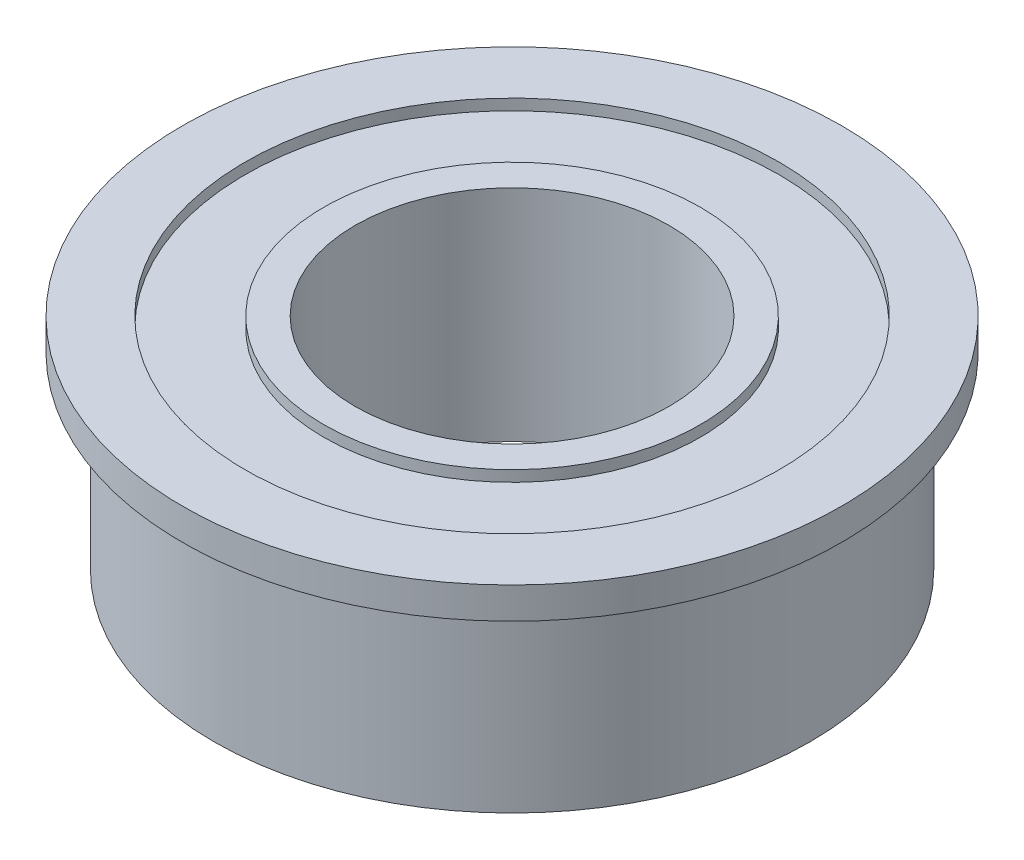
ISO-10303-21;
HEADER;
FILE_DESCRIPTION(('STEP AP214'),'2;1');
FILE_NAME('part.step','',(''),(''),'','','');
FILE_SCHEMA(('AUTOMOTIVE_DESIGN { 1 0 10303 214 1 1 1 1 }'));
ENDSEC;
DATA;
#1=APPLICATION_CONTEXT('core data for automotive mechanical design processes');
#2=APPLICATION_PROTOCOL_DEFINITION('international standard','automotive_design',2000,#1);
#3=PRODUCT_CONTEXT('',#1,'mechanical');
#4=PRODUCT('Part','Part','',(#3));
#5=PRODUCT_RELATED_PRODUCT_CATEGORY('part','',(#4));
#6=PRODUCT_DEFINITION_FORMATION('','',#4);
#7=PRODUCT_DEFINITION_CONTEXT('part definition',#1,'design');
#8=PRODUCT_DEFINITION('design','',#6,#7);
#9=PRODUCT_DEFINITION_SHAPE('','',#8);
#10=(LENGTH_UNIT() NAMED_UNIT(*) SI_UNIT(.MILLI.,.METRE.));
#11=(NAMED_UNIT(*) PLANE_ANGLE_UNIT() SI_UNIT($,.RADIAN.));
#12=(NAMED_UNIT(*) SI_UNIT($,.STERADIAN.) SOLID_ANGLE_UNIT());
#13=UNCERTAINTY_MEASURE_WITH_UNIT(LENGTH_MEASURE(1.E-05),#10,'distance_accuracy_value','');
#14=(GEOMETRIC_REPRESENTATION_CONTEXT(3) GLOBAL_UNCERTAINTY_ASSIGNED_CONTEXT((#13)) GLOBAL_UNIT_ASSIGNED_CONTEXT((#10,
#11,#12)) REPRESENTATION_CONTEXT('',''));
#15=CARTESIAN_POINT('',(0.,0.,0.));
#16=DIRECTION('',(0.,0.,1.));
#17=DIRECTION('',(1.,0.,0.));
#18=AXIS2_PLACEMENT_3D('',#15,#16,#17);
#19=CARTESIAN_POINT('',(5.,3.5,0.));
#20=DIRECTION('',(0.,1.,0.));
#21=DIRECTION('',(0.,0.,1.));
#22=AXIS2_PLACEMENT_3D('',#19,#20,#21);
#23=PLANE('',#22);
#24=CARTESIAN_POINT('',(0.,3.5,0.));
#25=DIRECTION('',(0.,-1.,0.));
#26=DIRECTION('',(0.,0.,-1.));
#27=AXIS2_PLACEMENT_3D('',#24,#25,#26);
#28=CIRCLE('',#27,5.);
#29=CARTESIAN_POINT('',(0.,3.5,-5.));
#30=VERTEX_POINT('',#29);
#31=EDGE_CURVE('E93',#30,#30,#28,.T.);
#32=ORIENTED_EDGE('',*,*,#31,.T.);
#33=EDGE_LOOP('',(#32));
#34=FACE_BOUND('',#33,.T.);
#35=CARTESIAN_POINT('',(0.,3.5,0.));
#36=DIRECTION('',(0.,-1.,0.));
#37=DIRECTION('',(0.,0.,-1.));
#38=AXIS2_PLACEMENT_3D('',#35,#36,#37);
#39=CIRCLE('',#38,6.);
#40=CARTESIAN_POINT('',(0.,3.5,-6.));
#41=VERTEX_POINT('',#40);
#42=EDGE_CURVE('E10',#41,#41,#39,.T.);
#43=ORIENTED_EDGE('',*,*,#42,.F.);
#44=EDGE_LOOP('',(#43));
#45=FACE_BOUND('',#44,.T.);
#46=ADVANCED_FACE('F44',(#34,#45),#23,.T.);
#47=CARTESIAN_POINT('',(0.,0.,0.));
#48=DIRECTION('',(0.,-1.,0.));
#49=DIRECTION('',(0.,0.,-1.));
#50=AXIS2_PLACEMENT_3D('',#47,#48,#49);
#51=CYLINDRICAL_SURFACE('',#50,6.);
#52=ORIENTED_EDGE('',*,*,#42,.T.);
#53=EDGE_LOOP('',(#52));
#54=FACE_BOUND('',#53,.T.);
#55=CARTESIAN_POINT('',(0.,3.15,0.));
#56=DIRECTION('',(0.,-1.,0.));
#57=DIRECTION('',(0.,0.,-1.));
#58=AXIS2_PLACEMENT_3D('',#55,#56,#57);
#59=CIRCLE('',#58,6.);
#60=CARTESIAN_POINT('',(0.,3.15,-6.));
#61=VERTEX_POINT('',#60);
#62=EDGE_CURVE('E51',#61,#61,#59,.T.);
#63=ORIENTED_EDGE('',*,*,#62,.F.);
#64=EDGE_LOOP('',(#63));
#65=FACE_BOUND('',#64,.T.);
#66=ADVANCED_FACE('F108',(#54,#65),#51,.T.);
#67=CARTESIAN_POINT('',(6.,3.15,0.));
#68=DIRECTION('',(0.,1.,0.));
#69=DIRECTION('',(0.,0.,1.));
#70=AXIS2_PLACEMENT_3D('',#67,#68,#69);
#71=PLANE('',#70);
#72=ORIENTED_EDGE('',*,*,#62,.T.);
#73=EDGE_LOOP('',(#72));
#74=FACE_BOUND('',#73,.T.);
#75=CARTESIAN_POINT('',(0.,3.15,0.));
#76=DIRECTION('',(0.,-1.,0.));
#77=DIRECTION('',(0.,0.,-1.));
#78=AXIS2_PLACEMENT_3D('',#75,#76,#77);
#79=CIRCLE('',#78,8.5);
#80=CARTESIAN_POINT('',(0.,3.15,-8.5));
#81=VERTEX_POINT('',#80);
#82=EDGE_CURVE('E54',#81,#81,#79,.T.);
#83=ORIENTED_EDGE('',*,*,#82,.F.);
#84=EDGE_LOOP('',(#83));
#85=FACE_BOUND('',#84,.T.);
#86=ADVANCED_FACE('F114',(#74,#85),#71,.T.);
#87=CARTESIAN_POINT('',(0.,0.,0.));
#88=DIRECTION('',(0.,-1.,0.));
#89=DIRECTION('',(0.,0.,-1.));
#90=AXIS2_PLACEMENT_3D('',#87,#88,#89);
#91=CYLINDRICAL_SURFACE('',#90,8.5);
#92=ORIENTED_EDGE('',*,*,#82,.T.);
#93=EDGE_LOOP('',(#92));
#94=FACE_BOUND('',#93,.T.);
#95=CARTESIAN_POINT('',(0.,3.5,0.));
#96=DIRECTION('',(0.,-1.,0.));
#97=DIRECTION('',(0.,0.,-1.));
#98=AXIS2_PLACEMENT_3D('',#95,#96,#97);
#99=CIRCLE('',#98,8.5);
#100=CARTESIAN_POINT('',(0.,3.5,-8.5));
#101=VERTEX_POINT('',#100);
#102=EDGE_CURVE('E56',#101,#101,#99,.T.);
#103=ORIENTED_EDGE('',*,*,#102,.F.);
#104=EDGE_LOOP('',(#103));
#105=FACE_BOUND('',#104,.T.);
#106=ADVANCED_FACE('F117',(#94,#105),#91,.F.);
#107=CARTESIAN_POINT('',(9.5,3.5,0.));
#108=DIRECTION('',(0.,1.,0.));
#109=DIRECTION('',(0.,0.,1.));
#110=AXIS2_PLACEMENT_3D('',#107,#108,#109);
#111=PLANE('',#110);
#112=ORIENTED_EDGE('',*,*,#102,.T.);
#113=EDGE_LOOP('',(#112));
#114=FACE_BOUND('',#113,.T.);
#115=CARTESIAN_POINT('',(0.,3.5,0.));
#116=DIRECTION('',(0.,-1.,0.));
#117=DIRECTION('',(0.,0.,-1.));
#118=AXIS2_PLACEMENT_3D('',#115,#116,#117);
#119=CIRCLE('',#118,10.5);
#120=CARTESIAN_POINT('',(0.,3.5,-10.5));
#121=VERTEX_POINT('',#120);
#122=EDGE_CURVE('E65',#121,#121,#119,.T.);
#123=ORIENTED_EDGE('',*,*,#122,.F.);
#124=EDGE_LOOP('',(#123));
#125=FACE_BOUND('',#124,.T.);
#126=ADVANCED_FACE('F121',(#114,#125),#111,.T.);
#127=CARTESIAN_POINT('',(0.,0.,0.));
#128=DIRECTION('',(0.,-1.,0.));
#129=DIRECTION('',(0.,0.,-1.));
#130=AXIS2_PLACEMENT_3D('',#127,#128,#129);
#131=CYLINDRICAL_SURFACE('',#130,10.5);
#132=ORIENTED_EDGE('',*,*,#122,.T.);
#133=EDGE_LOOP('',(#132));
#134=FACE_BOUND('',#133,.T.);
#135=CARTESIAN_POINT('',(0.,2.5,0.));
#136=DIRECTION('',(0.,-1.,0.));
#137=DIRECTION('',(0.,0.,-1.));
#138=AXIS2_PLACEMENT_3D('',#135,#136,#137);
#139=CIRCLE('',#138,10.5);
#140=CARTESIAN_POINT('',(0.,2.5,-10.5));
#141=VERTEX_POINT('',#140);
#142=EDGE_CURVE('E69',#141,#141,#139,.T.);
#143=ORIENTED_EDGE('',*,*,#142,.F.);
#144=EDGE_LOOP('',(#143));
#145=FACE_BOUND('',#144,.T.);
#146=ADVANCED_FACE('F126',(#134,#145),#131,.T.);
#147=CARTESIAN_POINT('',(10.5,2.5,0.));
#148=DIRECTION('',(0.,-1.,0.));
#149=DIRECTION('',(0.,0.,-1.));
#150=AXIS2_PLACEMENT_3D('',#147,#148,#149);
#151=PLANE('',#150);
#152=ORIENTED_EDGE('',*,*,#142,.T.);
#153=EDGE_LOOP('',(#152));
#154=FACE_BOUND('',#153,.T.);
#155=CARTESIAN_POINT('',(0.,2.5,0.));
#156=DIRECTION('',(0.,-1.,0.));
#157=DIRECTION('',(0.,0.,-1.));
#158=AXIS2_PLACEMENT_3D('',#155,#156,#157);
#159=CIRCLE('',#158,9.5);
#160=CARTESIAN_POINT('',(0.,2.5,-9.5));
#161=VERTEX_POINT('',#160);
#162=EDGE_CURVE('E68',#161,#161,#159,.T.);
#163=ORIENTED_EDGE('',*,*,#162,.F.);
#164=EDGE_LOOP('',(#163));
#165=FACE_BOUND('',#164,.T.);
#166=ADVANCED_FACE('F134',(#154,#165),#151,.T.);
#167=CARTESIAN_POINT('',(0.,0.,0.));
#168=DIRECTION('',(0.,-1.,0.));
#169=DIRECTION('',(0.,0.,-1.));
#170=AXIS2_PLACEMENT_3D('',#167,#168,#169);
#171=CYLINDRICAL_SURFACE('',#170,9.5);
#172=ORIENTED_EDGE('',*,*,#162,.T.);
#173=EDGE_LOOP('',(#172));
#174=FACE_BOUND('',#173,.T.);
#175=CARTESIAN_POINT('',(0.,-3.5,0.));
#176=DIRECTION('',(0.,-1.,0.));
#177=DIRECTION('',(0.,0.,-1.));
#178=AXIS2_PLACEMENT_3D('',#175,#176,#177);
#179=CIRCLE('',#178,9.5);
#180=CARTESIAN_POINT('',(0.,-3.5,-9.5));
#181=VERTEX_POINT('',#180);
#182=EDGE_CURVE('E71',#181,#181,#179,.T.);
#183=ORIENTED_EDGE('',*,*,#182,.F.);
#184=EDGE_LOOP('',(#183));
#185=FACE_BOUND('',#184,.T.);
#186=ADVANCED_FACE('F137',(#174,#185),#171,.T.);
#187=CARTESIAN_POINT('',(8.5,-3.5,0.));
#188=DIRECTION('',(0.,-1.,0.));
#189=DIRECTION('',(0.,0.,-1.));
#190=AXIS2_PLACEMENT_3D('',#187,#188,#189);
#191=PLANE('',#190);
#192=ORIENTED_EDGE('',*,*,#182,.T.);
#193=EDGE_LOOP('',(#192));
#194=FACE_BOUND('',#193,.T.);
#195=CARTESIAN_POINT('',(0.,-3.5,0.));
#196=DIRECTION('',(0.,-1.,0.));
#197=DIRECTION('',(0.,0.,-1.));
#198=AXIS2_PLACEMENT_3D('',#195,#196,#197);
#199=CIRCLE('',#198,8.5);
#200=CARTESIAN_POINT('',(0.,-3.5,-8.5));
#201=VERTEX_POINT('',#200);
#202=EDGE_CURVE('E78',#201,#201,#199,.T.);
#203=ORIENTED_EDGE('',*,*,#202,.F.);
#204=EDGE_LOOP('',(#203));
#205=FACE_BOUND('',#204,.T.);
#206=ADVANCED_FACE('F138',(#194,#205),#191,.T.);
#207=CARTESIAN_POINT('',(0.,0.,0.));
#208=DIRECTION('',(0.,-1.,0.));
#209=DIRECTION('',(0.,0.,-1.));
#210=AXIS2_PLACEMENT_3D('',#207,#208,#209);
#211=CYLINDRICAL_SURFACE('',#210,8.5);
#212=ORIENTED_EDGE('',*,*,#202,.T.);
#213=EDGE_LOOP('',(#212));
#214=FACE_BOUND('',#213,.T.);
#215=CARTESIAN_POINT('',(0.,-3.15,0.));
#216=DIRECTION('',(0.,-1.,0.));
#217=DIRECTION('',(0.,0.,-1.));
#218=AXIS2_PLACEMENT_3D('',#215,#216,#217);
#219=CIRCLE('',#218,8.5);
#220=CARTESIAN_POINT('',(0.,-3.15,-8.5));
#221=VERTEX_POINT('',#220);
#222=EDGE_CURVE('E80',#221,#221,#219,.T.);
#223=ORIENTED_EDGE('',*,*,#222,.F.);
#224=EDGE_LOOP('',(#223));
#225=FACE_BOUND('',#224,.T.);
#226=ADVANCED_FACE('F145',(#214,#225),#211,.F.);
#227=CARTESIAN_POINT('',(6.,-3.15,0.));
#228=DIRECTION('',(0.,-1.,0.));
#229=DIRECTION('',(0.,0.,-1.));
#230=AXIS2_PLACEMENT_3D('',#227,#228,#229);
#231=PLANE('',#230);
#232=ORIENTED_EDGE('',*,*,#222,.T.);
#233=EDGE_LOOP('',(#232));
#234=FACE_BOUND('',#233,.T.);
#235=CARTESIAN_POINT('',(0.,-3.15,0.));
#236=DIRECTION('',(0.,-1.,0.));
#237=DIRECTION('',(0.,0.,-1.));
#238=AXIS2_PLACEMENT_3D('',#235,#236,#237);
#239=CIRCLE('',#238,6.);
#240=CARTESIAN_POINT('',(0.,-3.15,-6.));
#241=VERTEX_POINT('',#240);
#242=EDGE_CURVE('E84',#241,#241,#239,.T.);
#243=ORIENTED_EDGE('',*,*,#242,.F.);
#244=EDGE_LOOP('',(#243));
#245=FACE_BOUND('',#244,.T.);
#246=ADVANCED_FACE('F146',(#234,#245),#231,.T.);
#247=CARTESIAN_POINT('',(0.,0.,0.));
#248=DIRECTION('',(0.,-1.,0.));
#249=DIRECTION('',(0.,0.,-1.));
#250=AXIS2_PLACEMENT_3D('',#247,#248,#249);
#251=CYLINDRICAL_SURFACE('',#250,6.);
#252=ORIENTED_EDGE('',*,*,#242,.T.);
#253=EDGE_LOOP('',(#252));
#254=FACE_BOUND('',#253,.T.);
#255=CARTESIAN_POINT('',(0.,-3.5,0.));
#256=DIRECTION('',(0.,-1.,0.));
#257=DIRECTION('',(0.,0.,-1.));
#258=AXIS2_PLACEMENT_3D('',#255,#256,#257);
#259=CIRCLE('',#258,6.);
#260=CARTESIAN_POINT('',(0.,-3.5,-6.));
#261=VERTEX_POINT('',#260);
#262=EDGE_CURVE('E83',#261,#261,#259,.T.);
#263=ORIENTED_EDGE('',*,*,#262,.F.);
#264=EDGE_LOOP('',(#263));
#265=FACE_BOUND('',#264,.T.);
#266=ADVANCED_FACE('F104',(#254,#265),#251,.T.);
#267=CARTESIAN_POINT('',(5.,-3.5,0.));
#268=DIRECTION('',(0.,-1.,0.));
#269=DIRECTION('',(0.,0.,-1.));
#270=AXIS2_PLACEMENT_3D('',#267,#268,#269);
#271=PLANE('',#270);
#272=ORIENTED_EDGE('',*,*,#262,.T.);
#273=EDGE_LOOP('',(#272));
#274=FACE_BOUND('',#273,.T.);
#275=CARTESIAN_POINT('',(0.,-3.5,0.));
#276=DIRECTION('',(0.,-1.,0.));
#277=DIRECTION('',(0.,0.,-1.));
#278=AXIS2_PLACEMENT_3D('',#275,#276,#277);
#279=CIRCLE('',#278,5.);
#280=CARTESIAN_POINT('',(0.,-3.5,-5.));
#281=VERTEX_POINT('',#280);
#282=EDGE_CURVE('E86',#281,#281,#279,.T.);
#283=ORIENTED_EDGE('',*,*,#282,.F.);
#284=EDGE_LOOP('',(#283));
#285=FACE_BOUND('',#284,.T.);
#286=ADVANCED_FACE('F97',(#274,#285),#271,.T.);
#287=CARTESIAN_POINT('',(0.,0.,0.));
#288=DIRECTION('',(0.,-1.,0.));
#289=DIRECTION('',(0.,0.,-1.));
#290=AXIS2_PLACEMENT_3D('',#287,#288,#289);
#291=CYLINDRICAL_SURFACE('',#290,5.);
#292=ORIENTED_EDGE('',*,*,#282,.T.);
#293=EDGE_LOOP('',(#292));
#294=FACE_BOUND('',#293,.T.);
#295=ORIENTED_EDGE('',*,*,#31,.F.);
#296=EDGE_LOOP('',(#295));
#297=FACE_BOUND('',#296,.T.);
#298=ADVANCED_FACE('F100',(#294,#297),#291,.F.);
#299=CLOSED_SHELL('',(#46,#66,#86,#106,#126,#146,#166,#186,#206,#226,#246,#266,#286,#298));
#300=MANIFOLD_SOLID_BREP('B2',#299);
#301=ADVANCED_BREP_SHAPE_REPRESENTATION('',(#18,#300),#14);
#302=SHAPE_DEFINITION_REPRESENTATION(#9,#301);
ENDSEC;
END-ISO-10303-21;
